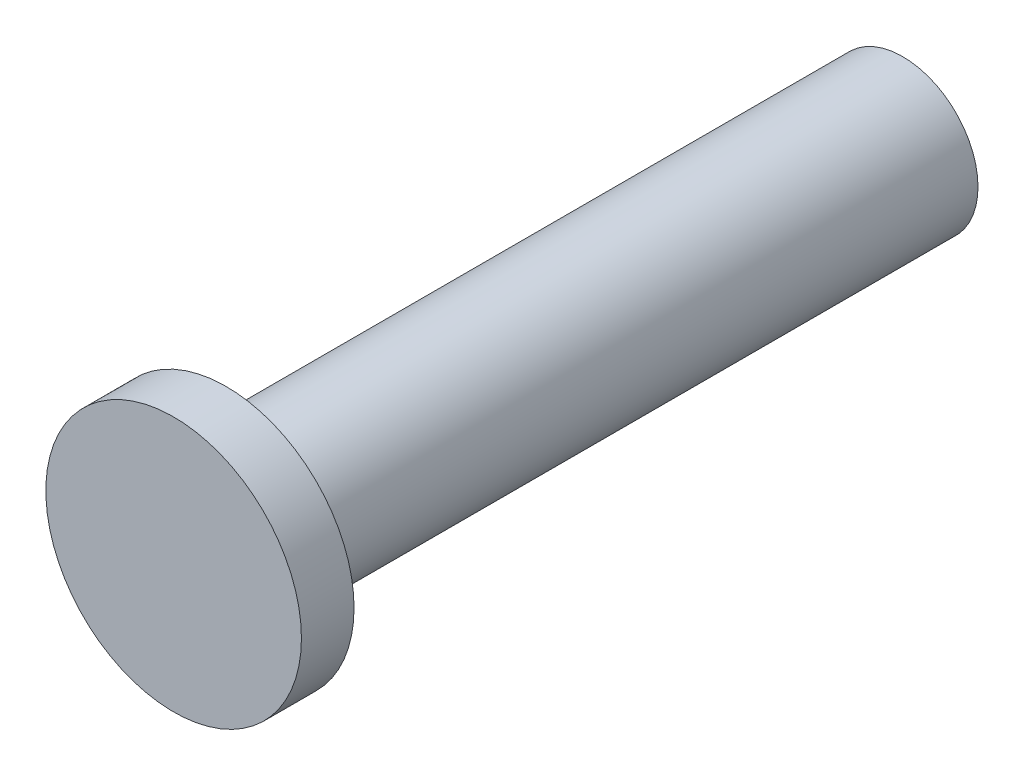
ISO-10303-21;
HEADER;
FILE_DESCRIPTION(('STEP AP214'),'2;1');
FILE_NAME('part.step','',(''),(''),'','','');
FILE_SCHEMA(('AUTOMOTIVE_DESIGN { 1 0 10303 214 1 1 1 1 }'));
ENDSEC;
DATA;
#1=APPLICATION_CONTEXT('core data for automotive mechanical design processes');
#2=APPLICATION_PROTOCOL_DEFINITION('international standard','automotive_design',2000,#1);
#3=PRODUCT_CONTEXT('',#1,'mechanical');
#4=PRODUCT('Part','Part','',(#3));
#5=PRODUCT_RELATED_PRODUCT_CATEGORY('part','',(#4));
#6=PRODUCT_DEFINITION_FORMATION('','',#4);
#7=PRODUCT_DEFINITION_CONTEXT('part definition',#1,'design');
#8=PRODUCT_DEFINITION('design','',#6,#7);
#9=PRODUCT_DEFINITION_SHAPE('','',#8);
#10=(LENGTH_UNIT() NAMED_UNIT(*) SI_UNIT(.MILLI.,.METRE.));
#11=(NAMED_UNIT(*) PLANE_ANGLE_UNIT() SI_UNIT($,.RADIAN.));
#12=(NAMED_UNIT(*) SI_UNIT($,.STERADIAN.) SOLID_ANGLE_UNIT());
#13=UNCERTAINTY_MEASURE_WITH_UNIT(LENGTH_MEASURE(1.E-05),#10,'distance_accuracy_value','');
#14=(GEOMETRIC_REPRESENTATION_CONTEXT(3) GLOBAL_UNCERTAINTY_ASSIGNED_CONTEXT((#13)) GLOBAL_UNIT_ASSIGNED_CONTEXT((#10,
#11,#12)) REPRESENTATION_CONTEXT('',''));
#15=CARTESIAN_POINT('',(0.,0.,0.));
#16=DIRECTION('',(0.,0.,1.));
#17=DIRECTION('',(1.,0.,0.));
#18=AXIS2_PLACEMENT_3D('',#15,#16,#17);
#19=CARTESIAN_POINT('',(0.,0.,0.));
#20=DIRECTION('',(0.,0.,-1.));
#21=DIRECTION('',(-1.,0.,0.));
#22=AXIS2_PLACEMENT_3D('',#19,#20,#21);
#23=CYLINDRICAL_SURFACE('',#22,1.);
#24=CARTESIAN_POINT('',(0.,0.,0.));
#25=DIRECTION('',(0.,0.,1.));
#26=DIRECTION('',(1.,0.,0.));
#27=AXIS2_PLACEMENT_3D('',#24,#25,#26);
#28=CIRCLE('',#27,1.);
#29=CARTESIAN_POINT('',(1.,0.,0.));
#30=VERTEX_POINT('',#29);
#31=EDGE_CURVE('E10',#30,#30,#28,.T.);
#32=ORIENTED_EDGE('',*,*,#31,.F.);
#33=EDGE_LOOP('',(#32));
#34=FACE_BOUND('',#33,.T.);
#35=CARTESIAN_POINT('',(0.,0.,-9.));
#36=DIRECTION('',(0.,0.,1.));
#37=DIRECTION('',(1.,0.,0.));
#38=AXIS2_PLACEMENT_3D('',#35,#36,#37);
#39=CIRCLE('',#38,1.);
#40=CARTESIAN_POINT('',(1.,0.,-9.));
#41=VERTEX_POINT('',#40);
#42=EDGE_CURVE('E45',#41,#41,#39,.T.);
#43=ORIENTED_EDGE('',*,*,#42,.T.);
#44=EDGE_LOOP('',(#43));
#45=FACE_BOUND('',#44,.T.);
#46=ADVANCED_FACE('F39',(#34,#45),#23,.T.);
#47=CARTESIAN_POINT('',(0.,0.,-9.));
#48=DIRECTION('',(0.,0.,1.));
#49=DIRECTION('',(1.,0.,0.));
#50=AXIS2_PLACEMENT_3D('',#47,#48,#49);
#51=PLANE('',#50);
#52=ORIENTED_EDGE('',*,*,#42,.F.);
#53=EDGE_LOOP('',(#52));
#54=FACE_BOUND('',#53,.T.);
#55=ADVANCED_FACE('F62',(#54),#51,.F.);
#56=CARTESIAN_POINT('',(0.,0.,0.7));
#57=DIRECTION('',(0.,0.,-1.));
#58=DIRECTION('',(-1.,0.,0.));
#59=AXIS2_PLACEMENT_3D('',#56,#57,#58);
#60=CYLINDRICAL_SURFACE('',#59,1.7);
#61=CARTESIAN_POINT('',(0.,0.,0.7));
#62=DIRECTION('',(0.,0.,1.));
#63=DIRECTION('',(1.,0.,0.));
#64=AXIS2_PLACEMENT_3D('',#61,#62,#63);
#65=CIRCLE('',#64,1.7);
#66=CARTESIAN_POINT('',(1.7,0.,0.7));
#67=VERTEX_POINT('',#66);
#68=EDGE_CURVE('E47',#67,#67,#65,.T.);
#69=ORIENTED_EDGE('',*,*,#68,.F.);
#70=EDGE_LOOP('',(#69));
#71=FACE_BOUND('',#70,.T.);
#72=CARTESIAN_POINT('',(0.,0.,0.));
#73=DIRECTION('',(0.,0.,1.));
#74=DIRECTION('',(1.,0.,0.));
#75=AXIS2_PLACEMENT_3D('',#72,#73,#74);
#76=CIRCLE('',#75,1.7);
#77=CARTESIAN_POINT('',(1.7,0.,0.));
#78=VERTEX_POINT('',#77);
#79=EDGE_CURVE('E51',#78,#78,#76,.T.);
#80=ORIENTED_EDGE('',*,*,#79,.T.);
#81=EDGE_LOOP('',(#80));
#82=FACE_BOUND('',#81,.T.);
#83=ADVANCED_FACE('F56',(#71,#82),#60,.T.);
#84=CARTESIAN_POINT('',(0.,0.,0.7));
#85=DIRECTION('',(0.,0.,1.));
#86=DIRECTION('',(1.,0.,0.));
#87=AXIS2_PLACEMENT_3D('',#84,#85,#86);
#88=PLANE('',#87);
#89=ORIENTED_EDGE('',*,*,#68,.T.);
#90=EDGE_LOOP('',(#89));
#91=FACE_BOUND('',#90,.T.);
#92=ADVANCED_FACE('F60',(#91),#88,.T.);
#93=CARTESIAN_POINT('',(0.,0.,0.));
#94=DIRECTION('',(0.,0.,1.));
#95=DIRECTION('',(1.,0.,0.));
#96=AXIS2_PLACEMENT_3D('',#93,#94,#95);
#97=PLANE('',#96);
#98=ORIENTED_EDGE('',*,*,#31,.T.);
#99=EDGE_LOOP('',(#98));
#100=FACE_BOUND('',#99,.T.);
#101=ORIENTED_EDGE('',*,*,#79,.F.);
#102=EDGE_LOOP('',(#101));
#103=FACE_BOUND('',#102,.T.);
#104=ADVANCED_FACE('F67',(#100,#103),#97,.F.);
#105=CLOSED_SHELL('',(#46,#55,#83,#92,#104));
#106=MANIFOLD_SOLID_BREP('B2',#105);
#107=ADVANCED_BREP_SHAPE_REPRESENTATION('',(#18,#106),#14);
#108=SHAPE_DEFINITION_REPRESENTATION(#9,#107);
ENDSEC;
END-ISO-10303-21;
